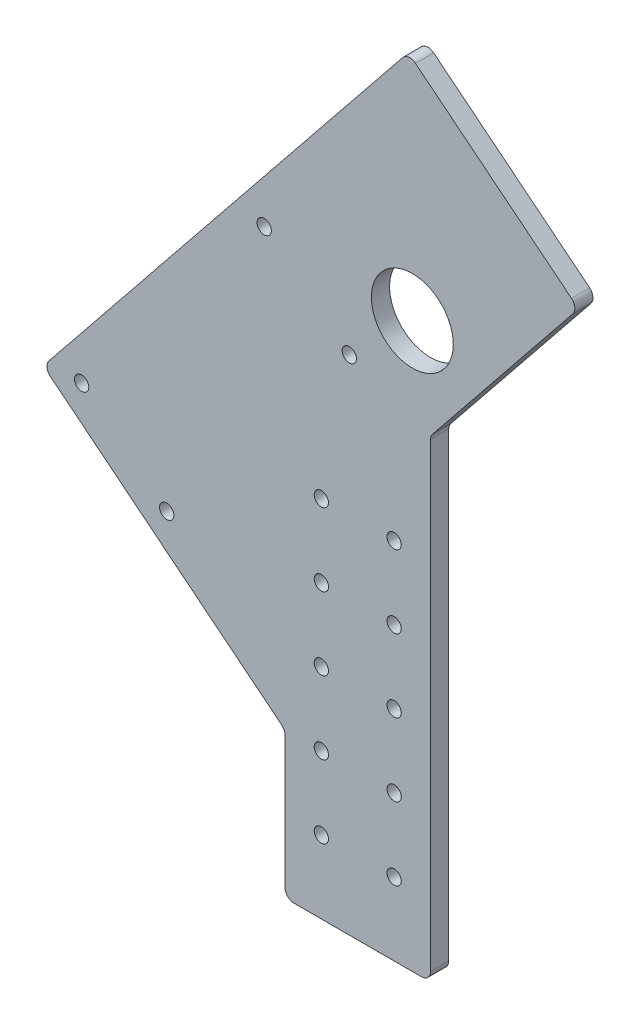
ISO-10303-21;
HEADER;
FILE_DESCRIPTION(('STEP AP214'),'2;1');
FILE_NAME('part.step','',(''),(''),'','','');
FILE_SCHEMA(('AUTOMOTIVE_DESIGN { 1 0 10303 214 1 1 1 1 }'));
ENDSEC;
DATA;
#1=APPLICATION_CONTEXT('core data for automotive mechanical design processes');
#2=APPLICATION_PROTOCOL_DEFINITION('international standard','automotive_design',2000,#1);
#3=PRODUCT_CONTEXT('',#1,'mechanical');
#4=PRODUCT('Part','Part','',(#3));
#5=PRODUCT_RELATED_PRODUCT_CATEGORY('part','',(#4));
#6=PRODUCT_DEFINITION_FORMATION('','',#4);
#7=PRODUCT_DEFINITION_CONTEXT('part definition',#1,'design');
#8=PRODUCT_DEFINITION('design','',#6,#7);
#9=PRODUCT_DEFINITION_SHAPE('','',#8);
#10=(LENGTH_UNIT() NAMED_UNIT(*) SI_UNIT(.MILLI.,.METRE.));
#11=(NAMED_UNIT(*) PLANE_ANGLE_UNIT() SI_UNIT($,.RADIAN.));
#12=(NAMED_UNIT(*) SI_UNIT($,.STERADIAN.) SOLID_ANGLE_UNIT());
#13=UNCERTAINTY_MEASURE_WITH_UNIT(LENGTH_MEASURE(1.E-05),#10,'distance_accuracy_value','');
#14=(GEOMETRIC_REPRESENTATION_CONTEXT(3) GLOBAL_UNCERTAINTY_ASSIGNED_CONTEXT((#13)) GLOBAL_UNIT_ASSIGNED_CONTEXT((#10,
#11,#12)) REPRESENTATION_CONTEXT('',''));
#15=CARTESIAN_POINT('',(0.,0.,0.));
#16=DIRECTION('',(0.,0.,1.));
#17=DIRECTION('',(1.,0.,0.));
#18=AXIS2_PLACEMENT_3D('',#15,#16,#17);
#19=CARTESIAN_POINT('',(555.620950118593,690.465880705157,6.35));
#20=DIRECTION('',(0.626927314469008,0.779077751172935,0.));
#21=DIRECTION('',(-0.779077751172935,0.626927314469008,0.));
#22=AXIS2_PLACEMENT_3D('',#19,#20,#21);
#23=PLANE('',#22);
#24=DIRECTION('',(0.779077751172935,-0.626927314469008,0.));
#25=VECTOR('',#24,1.);
#26=CARTESIAN_POINT('',(555.620950118593,690.465880705157,6.35));
#27=LINE('',#26,#25);
#28=CARTESIAN_POINT('',(591.644329675427,661.477707740825,6.35));
#29=VERTEX_POINT('',#28);
#30=CARTESIAN_POINT('',(646.062910594856,617.686834825165,6.35));
#31=VERTEX_POINT('',#30);
#32=EDGE_CURVE('E396',#29,#31,#27,.T.);
#33=ORIENTED_EDGE('',*,*,#32,.T.);
#34=DIRECTION('',(0.,0.,-1.));
#35=VECTOR('',#34,1.);
#36=CARTESIAN_POINT('',(646.062910594856,617.686834825165,0.));
#37=LINE('',#36,#35);
#38=CARTESIAN_POINT('',(646.062910594856,617.686834825165,0.));
#39=VERTEX_POINT('',#38);
#40=EDGE_CURVE('E159',#31,#39,#37,.T.);
#41=ORIENTED_EDGE('',*,*,#40,.T.);
#42=DIRECTION('',(0.779077751172935,-0.626927314469008,0.));
#43=VECTOR('',#42,1.);
#44=CARTESIAN_POINT('',(555.620950118593,690.465880705157,0.));
#45=LINE('',#44,#43);
#46=CARTESIAN_POINT('',(591.644329675427,661.477707740825,0.));
#47=VERTEX_POINT('',#46);
#48=EDGE_CURVE('E314',#47,#39,#45,.T.);
#49=ORIENTED_EDGE('',*,*,#48,.F.);
#50=DIRECTION('',(0.,0.,-1.));
#51=VECTOR('',#50,1.);
#52=CARTESIAN_POINT('',(591.644329675427,661.477707740825,6.35));
#53=LINE('',#52,#51);
#54=EDGE_CURVE('E252',#47,#29,#53,.F.);
#55=ORIENTED_EDGE('',*,*,#54,.T.);
#56=EDGE_LOOP('',(#33,#41,#49,#55));
#57=FACE_BOUND('',#56,.T.);
#58=ADVANCED_FACE('F45',(#57),#23,.T.);
#59=CARTESIAN_POINT('',(33.5498076968577,-26.9976787408911,6.35));
#60=DIRECTION('',(0.779077751172932,-0.626927314469011,0.));
#61=DIRECTION('',(0.626927314469011,0.779077751172933,0.));
#62=AXIS2_PLACEMENT_3D('',#59,#60,#61);
#63=PLANE('',#62);
#64=DIRECTION('',(-0.626927314469011,-0.779077751172932,0.));
#65=VECTOR('',#64,1.);
#66=CARTESIAN_POINT('',(33.5498076968577,-26.9976787408911,0.));
#67=LINE('',#66,#65);
#68=CARTESIAN_POINT('',(587.180263592014,660.994630104289,0.));
#69=VERTEX_POINT('',#68);
#70=CARTESIAN_POINT('',(463.769621738789,507.633174785898,0.));
#71=VERTEX_POINT('',#70);
#72=EDGE_CURVE('E273',#69,#71,#67,.T.);
#73=ORIENTED_EDGE('',*,*,#72,.T.);
#74=DIRECTION('',(0.,0.,-1.));
#75=VECTOR('',#74,1.);
#76=CARTESIAN_POINT('',(463.769621738789,507.633174785898,6.35));
#77=LINE('',#76,#75);
#78=CARTESIAN_POINT('',(463.769621738789,507.633174785898,6.35));
#79=VERTEX_POINT('',#78);
#80=EDGE_CURVE('E249',#71,#79,#77,.F.);
#81=ORIENTED_EDGE('',*,*,#80,.T.);
#82=DIRECTION('',(-0.626927314469011,-0.779077751172932,0.));
#83=VECTOR('',#82,1.);
#84=CARTESIAN_POINT('',(33.5498076968577,-26.9976787408911,6.35));
#85=LINE('',#84,#83);
#86=CARTESIAN_POINT('',(587.180263592014,660.994630104289,6.35));
#87=VERTEX_POINT('',#86);
#88=EDGE_CURVE('E288',#87,#79,#85,.T.);
#89=ORIENTED_EDGE('',*,*,#88,.F.);
#90=DIRECTION('',(0.,0.,-1.));
#91=VECTOR('',#90,1.);
#92=CARTESIAN_POINT('',(587.180263592014,660.994630104289,0.));
#93=LINE('',#92,#91);
#94=EDGE_CURVE('E245',#87,#69,#93,.T.);
#95=ORIENTED_EDGE('',*,*,#94,.T.);
#96=EDGE_LOOP('',(#73,#81,#89,#95));
#97=FACE_BOUND('',#96,.T.);
#98=ADVANCED_FACE('F350',(#97),#63,.F.);
#99=CARTESIAN_POINT('',(428.229319818492,532.157281666816,6.35));
#100=DIRECTION('',(0.62692731446901,0.779077751172933,0.));
#101=DIRECTION('',(-0.779077751172934,0.62692731446901,0.));
#102=AXIS2_PLACEMENT_3D('',#99,#100,#101);
#103=PLANE('',#102);
#104=DIRECTION('',(0.779077751172933,-0.62692731446901,0.));
#105=VECTOR('',#104,1.);
#106=CARTESIAN_POINT('',(428.229319818492,532.157281666816,0.));
#107=LINE('',#106,#105);
#108=CARTESIAN_POINT('',(464.252699375324,503.169108702485,0.));
#109=VERTEX_POINT('',#108);
#110=CARTESIAN_POINT('',(544.915494223451,438.259400684811,0.));
#111=VERTEX_POINT('',#110);
#112=EDGE_CURVE('E263',#109,#111,#107,.T.);
#113=ORIENTED_EDGE('',*,*,#112,.T.);
#114=DIRECTION('',(0.,0.,-1.));
#115=VECTOR('',#114,1.);
#116=CARTESIAN_POINT('',(544.915494223451,438.259400684811,6.35));
#117=LINE('',#116,#115);
#118=CARTESIAN_POINT('',(544.915494223451,438.259400684811,6.35));
#119=VERTEX_POINT('',#118);
#120=EDGE_CURVE('E242',#111,#119,#117,.F.);
#121=ORIENTED_EDGE('',*,*,#120,.T.);
#122=DIRECTION('',(0.779077751172933,-0.62692731446901,0.));
#123=VECTOR('',#122,1.);
#124=CARTESIAN_POINT('',(428.229319818492,532.157281666816,6.35));
#125=LINE('',#124,#123);
#126=CARTESIAN_POINT('',(464.252699375324,503.169108702485,6.35));
#127=VERTEX_POINT('',#126);
#128=EDGE_CURVE('E281',#127,#119,#125,.T.);
#129=ORIENTED_EDGE('',*,*,#128,.F.);
#130=DIRECTION('',(0.,0.,-1.));
#131=VECTOR('',#130,1.);
#132=CARTESIAN_POINT('',(464.252699375324,503.169108702485,6.35));
#133=LINE('',#132,#131);
#134=EDGE_CURVE('E238',#127,#109,#133,.T.);
#135=ORIENTED_EDGE('',*,*,#134,.T.);
#136=EDGE_LOOP('',(#113,#121,#129,#135));
#137=FACE_BOUND('',#136,.T.);
#138=ADVANCED_FACE('F269',(#137),#103,.F.);
#139=CARTESIAN_POINT('',(546.100000000012,0.,6.35));
#140=DIRECTION('',(-1.,0.,0.));
#141=DIRECTION('',(0.,0.,1.));
#142=AXIS2_PLACEMENT_3D('',#139,#140,#141);
#143=PLANE('',#142);
#144=DIRECTION('',(0.,1.,0.));
#145=VECTOR('',#144,1.);
#146=CARTESIAN_POINT('',(546.100000000012,0.,0.));
#147=LINE('',#146,#145);
#148=CARTESIAN_POINT('',(546.100000000012,389.681223643939,0.));
#149=VERTEX_POINT('',#148);
#150=CARTESIAN_POINT('',(546.100000000012,435.785828824837,0.));
#151=VERTEX_POINT('',#150);
#152=EDGE_CURVE('E264',#149,#151,#147,.T.);
#153=ORIENTED_EDGE('',*,*,#152,.F.);
#154=DIRECTION('',(0.,0.,-1.));
#155=VECTOR('',#154,1.);
#156=CARTESIAN_POINT('',(546.100000000012,389.681223643939,6.35));
#157=LINE('',#156,#155);
#158=CARTESIAN_POINT('',(546.100000000012,389.681223643939,6.35));
#159=VERTEX_POINT('',#158);
#160=EDGE_CURVE('E66',#149,#159,#157,.F.);
#161=ORIENTED_EDGE('',*,*,#160,.T.);
#162=DIRECTION('',(0.,1.,0.));
#163=VECTOR('',#162,1.);
#164=CARTESIAN_POINT('',(546.100000000012,0.,6.35));
#165=LINE('',#164,#163);
#166=CARTESIAN_POINT('',(546.100000000012,435.785828824837,6.35));
#167=VERTEX_POINT('',#166);
#168=EDGE_CURVE('E277',#159,#167,#165,.T.);
#169=ORIENTED_EDGE('',*,*,#168,.T.);
#170=DIRECTION('',(0.,0.,-1.));
#171=VECTOR('',#170,1.);
#172=CARTESIAN_POINT('',(546.100000000012,435.785828824837,6.35));
#173=LINE('',#172,#171);
#174=EDGE_CURVE('E232',#167,#151,#173,.T.);
#175=ORIENTED_EDGE('',*,*,#174,.T.);
#176=EDGE_LOOP('',(#153,#161,#169,#175));
#177=FACE_BOUND('',#176,.T.);
#178=ADVANCED_FACE('F276',(#177),#143,.T.);
#179=CARTESIAN_POINT('',(0.,386.506223643939,6.35));
#180=DIRECTION('',(0.,-1.,0.));
#181=DIRECTION('',(0.,0.,-1.));
#182=AXIS2_PLACEMENT_3D('',#179,#180,#181);
#183=PLANE('',#182);
#184=DIRECTION('',(-1.,0.,0.));
#185=VECTOR('',#184,1.);
#186=CARTESIAN_POINT('',(0.,386.506223643939,0.));
#187=LINE('',#186,#185);
#188=CARTESIAN_POINT('',(593.725000000012,386.506223643939,0.));
#189=VERTEX_POINT('',#188);
#190=CARTESIAN_POINT('',(549.275000000012,386.506223643939,0.));
#191=VERTEX_POINT('',#190);
#192=EDGE_CURVE('E185',#189,#191,#187,.T.);
#193=ORIENTED_EDGE('',*,*,#192,.F.);
#194=DIRECTION('',(0.,0.,-1.));
#195=VECTOR('',#194,1.);
#196=CARTESIAN_POINT('',(593.725000000012,386.506223643939,6.35));
#197=LINE('',#196,#195);
#198=CARTESIAN_POINT('',(593.725000000012,386.506223643939,6.35));
#199=VERTEX_POINT('',#198);
#200=EDGE_CURVE('E214',#189,#199,#197,.F.);
#201=ORIENTED_EDGE('',*,*,#200,.T.);
#202=DIRECTION('',(-1.,0.,0.));
#203=VECTOR('',#202,1.);
#204=CARTESIAN_POINT('',(0.,386.506223643939,6.35));
#205=LINE('',#204,#203);
#206=CARTESIAN_POINT('',(549.275000000012,386.506223643939,6.35));
#207=VERTEX_POINT('',#206);
#208=EDGE_CURVE('E280',#199,#207,#205,.T.);
#209=ORIENTED_EDGE('',*,*,#208,.T.);
#210=DIRECTION('',(0.,0.,-1.));
#211=VECTOR('',#210,1.);
#212=CARTESIAN_POINT('',(549.275000000012,386.506223643939,6.35));
#213=LINE('',#212,#211);
#214=EDGE_CURVE('E210',#207,#191,#213,.T.);
#215=ORIENTED_EDGE('',*,*,#214,.T.);
#216=EDGE_LOOP('',(#193,#201,#209,#215));
#217=FACE_BOUND('',#216,.T.);
#218=ADVANCED_FACE('F326',(#217),#183,.T.);
#219=CARTESIAN_POINT('',(596.900000000012,0.,6.35));
#220=DIRECTION('',(-1.,0.,0.));
#221=DIRECTION('',(0.,0.,1.));
#222=AXIS2_PLACEMENT_3D('',#219,#220,#221);
#223=PLANE('',#222);
#224=DIRECTION('',(0.,1.,0.));
#225=VECTOR('',#224,1.);
#226=CARTESIAN_POINT('',(596.900000000012,0.,0.));
#227=LINE('',#226,#225);
#228=CARTESIAN_POINT('',(596.900000000012,389.681223643939,0.));
#229=VERTEX_POINT('',#228);
#230=CARTESIAN_POINT('',(596.900000000012,550.409246189396,0.));
#231=VERTEX_POINT('',#230);
#232=EDGE_CURVE('E178',#229,#231,#227,.T.);
#233=ORIENTED_EDGE('',*,*,#232,.T.);
#234=DIRECTION('',(0.,0.,-1.));
#235=VECTOR('',#234,1.);
#236=CARTESIAN_POINT('',(596.900000000012,550.409246189396,6.35));
#237=LINE('',#236,#235);
#238=CARTESIAN_POINT('',(596.900000000012,550.409246189396,6.35));
#239=VERTEX_POINT('',#238);
#240=EDGE_CURVE('E152',#231,#239,#237,.F.);
#241=ORIENTED_EDGE('',*,*,#240,.T.);
#242=DIRECTION('',(0.,1.,0.));
#243=VECTOR('',#242,1.);
#244=CARTESIAN_POINT('',(596.900000000012,0.,6.35));
#245=LINE('',#244,#243);
#246=CARTESIAN_POINT('',(596.900000000012,389.681223643939,6.35));
#247=VERTEX_POINT('',#246);
#248=EDGE_CURVE('E286',#247,#239,#245,.T.);
#249=ORIENTED_EDGE('',*,*,#248,.F.);
#250=DIRECTION('',(0.,0.,-1.));
#251=VECTOR('',#250,1.);
#252=CARTESIAN_POINT('',(596.900000000012,389.681223643939,0.));
#253=LINE('',#252,#251);
#254=EDGE_CURVE('E170',#247,#229,#253,.T.);
#255=ORIENTED_EDGE('',*,*,#254,.T.);
#256=EDGE_LOOP('',(#233,#241,#249,#255));
#257=FACE_BOUND('',#256,.T.);
#258=ADVANCED_FACE('F336',(#257),#223,.F.);
#259=CARTESIAN_POINT('',(538.867140915641,585.763135354699,6.35));
#260=DIRECTION('',(0.,0.,-1.));
#261=DIRECTION('',(-1.,0.,0.));
#262=AXIS2_PLACEMENT_3D('',#259,#260,#261);
#263=CYLINDRICAL_SURFACE('',#262,2.48919999999983);
#264=CARTESIAN_POINT('',(538.867140915641,585.763135354699,6.35));
#265=DIRECTION('',(0.,0.,1.));
#266=DIRECTION('',(1.,0.,0.));
#267=AXIS2_PLACEMENT_3D('',#264,#265,#266);
#268=CIRCLE('',#267,2.48919999999983);
#269=CARTESIAN_POINT('',(541.356340915641,585.763135354699,6.35));
#270=VERTEX_POINT('',#269);
#271=EDGE_CURVE('E401',#270,#270,#268,.T.);
#272=ORIENTED_EDGE('',*,*,#271,.T.);
#273=EDGE_LOOP('',(#272));
#274=FACE_BOUND('',#273,.T.);
#275=CARTESIAN_POINT('',(538.867140915641,585.763135354699,0.));
#276=DIRECTION('',(0.,0.,1.));
#277=DIRECTION('',(1.,0.,0.));
#278=AXIS2_PLACEMENT_3D('',#275,#276,#277);
#279=CIRCLE('',#278,2.48919999999983);
#280=CARTESIAN_POINT('',(541.356340915641,585.763135354699,0.));
#281=VERTEX_POINT('',#280);
#282=EDGE_CURVE('E310',#281,#281,#279,.T.);
#283=ORIENTED_EDGE('',*,*,#282,.F.);
#284=EDGE_LOOP('',(#283));
#285=FACE_BOUND('',#284,.T.);
#286=ADVANCED_FACE('F338',(#274,#285),#263,.F.);
#287=CARTESIAN_POINT('',(568.55000323533,561.87720467343,6.35));
#288=DIRECTION('',(0.,0.,-1.));
#289=DIRECTION('',(-1.,0.,0.));
#290=AXIS2_PLACEMENT_3D('',#287,#288,#289);
#291=CYLINDRICAL_SURFACE('',#290,2.48919999999994);
#292=CARTESIAN_POINT('',(568.55000323533,561.87720467343,6.35));
#293=DIRECTION('',(0.,0.,1.));
#294=DIRECTION('',(1.,0.,0.));
#295=AXIS2_PLACEMENT_3D('',#292,#293,#294);
#296=CIRCLE('',#295,2.48919999999994);
#297=CARTESIAN_POINT('',(571.03920323533,561.87720467343,6.35));
#298=VERTEX_POINT('',#297);
#299=EDGE_CURVE('E407',#298,#298,#296,.T.);
#300=ORIENTED_EDGE('',*,*,#299,.T.);
#301=EDGE_LOOP('',(#300));
#302=FACE_BOUND('',#301,.T.);
#303=CARTESIAN_POINT('',(568.55000323533,561.87720467343,0.));
#304=DIRECTION('',(0.,0.,1.));
#305=DIRECTION('',(1.,0.,0.));
#306=AXIS2_PLACEMENT_3D('',#303,#304,#305);
#307=CIRCLE('',#306,2.48919999999994);
#308=CARTESIAN_POINT('',(571.03920323533,561.87720467343,0.));
#309=VERTEX_POINT('',#308);
#310=EDGE_CURVE('E306',#309,#309,#307,.T.);
#311=ORIENTED_EDGE('',*,*,#310,.F.);
#312=EDGE_LOOP('',(#311));
#313=FACE_BOUND('',#312,.T.);
#314=ADVANCED_FACE('F344',(#302,#313),#291,.F.);
#315=CARTESIAN_POINT('',(504.854188085278,482.72290515426,6.35));
#316=DIRECTION('',(0.,0.,-1.));
#317=DIRECTION('',(-1.,0.,0.));
#318=AXIS2_PLACEMENT_3D('',#315,#316,#317);
#319=CYLINDRICAL_SURFACE('',#318,2.48919999999995);
#320=CARTESIAN_POINT('',(504.854188085278,482.72290515426,6.35));
#321=DIRECTION('',(0.,0.,1.));
#322=DIRECTION('',(1.,0.,0.));
#323=AXIS2_PLACEMENT_3D('',#320,#321,#322);
#324=CIRCLE('',#323,2.48919999999995);
#325=CARTESIAN_POINT('',(507.343388085278,482.72290515426,6.35));
#326=VERTEX_POINT('',#325);
#327=EDGE_CURVE('E183',#326,#326,#324,.T.);
#328=ORIENTED_EDGE('',*,*,#327,.T.);
#329=EDGE_LOOP('',(#328));
#330=FACE_BOUND('',#329,.T.);
#331=CARTESIAN_POINT('',(504.854188085278,482.72290515426,0.));
#332=DIRECTION('',(0.,0.,1.));
#333=DIRECTION('',(1.,0.,0.));
#334=AXIS2_PLACEMENT_3D('',#331,#332,#333);
#335=CIRCLE('',#334,2.48919999999995);
#336=CARTESIAN_POINT('',(507.343388085278,482.72290515426,0.));
#337=VERTEX_POINT('',#336);
#338=EDGE_CURVE('E301',#337,#337,#335,.T.);
#339=ORIENTED_EDGE('',*,*,#338,.F.);
#340=EDGE_LOOP('',(#339));
#341=FACE_BOUND('',#340,.T.);
#342=ADVANCED_FACE('F363',(#330,#341),#319,.F.);
#343=CARTESIAN_POINT('',(475.17132576559,506.608835835529,6.35));
#344=DIRECTION('',(0.,0.,-1.));
#345=DIRECTION('',(-1.,0.,0.));
#346=AXIS2_PLACEMENT_3D('',#343,#344,#345);
#347=CYLINDRICAL_SURFACE('',#346,2.48919999999983);
#348=CARTESIAN_POINT('',(475.17132576559,506.608835835529,6.35));
#349=DIRECTION('',(0.,0.,1.));
#350=DIRECTION('',(1.,0.,0.));
#351=AXIS2_PLACEMENT_3D('',#348,#349,#350);
#352=CIRCLE('',#351,2.48919999999983);
#353=CARTESIAN_POINT('',(477.66052576559,506.608835835529,6.35));
#354=VERTEX_POINT('',#353);
#355=EDGE_CURVE('E177',#354,#354,#352,.T.);
#356=ORIENTED_EDGE('',*,*,#355,.T.);
#357=EDGE_LOOP('',(#356));
#358=FACE_BOUND('',#357,.T.);
#359=CARTESIAN_POINT('',(475.17132576559,506.608835835529,0.));
#360=DIRECTION('',(0.,0.,1.));
#361=DIRECTION('',(1.,0.,0.));
#362=AXIS2_PLACEMENT_3D('',#359,#360,#361);
#363=CIRCLE('',#362,2.48919999999983);
#364=CARTESIAN_POINT('',(477.66052576559,506.608835835529,0.));
#365=VERTEX_POINT('',#364);
#366=EDGE_CURVE('E297',#365,#365,#363,.T.);
#367=ORIENTED_EDGE('',*,*,#366,.F.);
#368=EDGE_LOOP('',(#367));
#369=FACE_BOUND('',#368,.T.);
#370=ADVANCED_FACE('F367',(#358,#369),#347,.F.);
#371=CARTESIAN_POINT('',(92.9155323362361,-74.7695401034303,6.35));
#372=DIRECTION('',(-0.779077751172933,0.62692731446901,0.));
#373=DIRECTION('',(-0.62692731446901,-0.779077751172933,0.));
#374=AXIS2_PLACEMENT_3D('',#371,#372,#373);
#375=PLANE('',#374);
#376=DIRECTION('',(0.62692731446901,0.779077751172933,0.));
#377=VECTOR('',#376,1.);
#378=CARTESIAN_POINT('',(92.9155323362361,-74.7695401034303,6.35));
#379=LINE('',#378,#377);
#380=CARTESIAN_POINT('',(597.601428140038,552.399740412835,6.35));
#381=VERTEX_POINT('',#380);
#382=CARTESIAN_POINT('',(646.545988231391,613.222768741752,6.35));
#383=VERTEX_POINT('',#382);
#384=EDGE_CURVE('E168',#381,#383,#379,.T.);
#385=ORIENTED_EDGE('',*,*,#384,.F.);
#386=DIRECTION('',(0.,0.,-1.));
#387=VECTOR('',#386,1.);
#388=CARTESIAN_POINT('',(597.601428140038,552.399740412835,0.));
#389=LINE('',#388,#387);
#390=CARTESIAN_POINT('',(597.601428140038,552.399740412835,0.));
#391=VERTEX_POINT('',#390);
#392=EDGE_CURVE('E151',#381,#391,#389,.T.);
#393=ORIENTED_EDGE('',*,*,#392,.T.);
#394=DIRECTION('',(0.62692731446901,0.779077751172933,0.));
#395=VECTOR('',#394,1.);
#396=CARTESIAN_POINT('',(92.9155323362361,-74.7695401034303,0.));
#397=LINE('',#396,#395);
#398=CARTESIAN_POINT('',(646.545988231391,613.222768741752,0.));
#399=VERTEX_POINT('',#398);
#400=EDGE_CURVE('E165',#391,#399,#397,.T.);
#401=ORIENTED_EDGE('',*,*,#400,.T.);
#402=DIRECTION('',(0.,0.,-1.));
#403=VECTOR('',#402,1.);
#404=CARTESIAN_POINT('',(646.545988231391,613.222768741751,6.35));
#405=LINE('',#404,#403);
#406=EDGE_CURVE('E171',#399,#383,#405,.F.);
#407=ORIENTED_EDGE('',*,*,#406,.T.);
#408=EDGE_LOOP('',(#385,#393,#401,#407));
#409=FACE_BOUND('',#408,.T.);
#410=ADVANCED_FACE('F164',(#409),#375,.F.);
#411=CARTESIAN_POINT('',(0.,0.,6.35));
#412=DIRECTION('',(0.,0.,1.));
#413=DIRECTION('',(1.,0.,0.));
#414=AXIS2_PLACEMENT_3D('',#411,#412,#413);
#415=PLANE('',#414);
#416=CARTESIAN_POINT('',(590.550000000012,583.139171886536,6.35));
#417=DIRECTION('',(0.,0.,1.));
#418=DIRECTION('',(1.,0.,0.));
#419=AXIS2_PLACEMENT_3D('',#416,#417,#418);
#420=CIRCLE('',#419,14.2875);
#421=CARTESIAN_POINT('',(604.837500000012,583.139171886536,6.35));
#422=VERTEX_POINT('',#421);
#423=EDGE_CURVE('E496',#422,#422,#420,.T.);
#424=ORIENTED_EDGE('',*,*,#423,.F.);
#425=EDGE_LOOP('',(#424));
#426=FACE_BOUND('',#425,.T.);
#427=CARTESIAN_POINT('',(584.200000000012,513.506223643939,6.35));
#428=DIRECTION('',(0.,0.,1.));
#429=DIRECTION('',(1.,0.,0.));
#430=AXIS2_PLACEMENT_3D('',#427,#428,#429);
#431=CIRCLE('',#430,2.48919999999994);
#432=CARTESIAN_POINT('',(586.689200000012,513.506223643939,6.35));
#433=VERTEX_POINT('',#432);
#434=EDGE_CURVE('E429',#433,#433,#431,.T.);
#435=ORIENTED_EDGE('',*,*,#434,.F.);
#436=EDGE_LOOP('',(#435));
#437=FACE_BOUND('',#436,.T.);
#438=CARTESIAN_POINT('',(558.800000000012,437.306223643939,6.35));
#439=DIRECTION('',(0.,0.,1.));
#440=DIRECTION('',(1.,0.,0.));
#441=AXIS2_PLACEMENT_3D('',#438,#439,#440);
#442=CIRCLE('',#441,2.48919999999995);
#443=CARTESIAN_POINT('',(561.289200000012,437.306223643939,6.35));
#444=VERTEX_POINT('',#443);
#445=EDGE_CURVE('E460',#444,#444,#442,.T.);
#446=ORIENTED_EDGE('',*,*,#445,.F.);
#447=EDGE_LOOP('',(#446));
#448=FACE_BOUND('',#447,.T.);
#449=CARTESIAN_POINT('',(558.800000000012,462.706223643939,6.35));
#450=DIRECTION('',(0.,0.,1.));
#451=DIRECTION('',(1.,0.,0.));
#452=AXIS2_PLACEMENT_3D('',#449,#450,#451);
#453=CIRCLE('',#452,2.48919999999995);
#454=CARTESIAN_POINT('',(561.289200000012,462.706223643939,6.35));
#455=VERTEX_POINT('',#454);
#456=EDGE_CURVE('E461',#455,#455,#453,.T.);
#457=ORIENTED_EDGE('',*,*,#456,.F.);
#458=EDGE_LOOP('',(#457));
#459=FACE_BOUND('',#458,.T.);
#460=CARTESIAN_POINT('',(558.800000000012,488.106223643939,6.35));
#461=DIRECTION('',(0.,0.,1.));
#462=DIRECTION('',(1.,0.,0.));
#463=AXIS2_PLACEMENT_3D('',#460,#461,#462);
#464=CIRCLE('',#463,2.48919999999995);
#465=CARTESIAN_POINT('',(561.289200000012,488.106223643939,6.35));
#466=VERTEX_POINT('',#465);
#467=EDGE_CURVE('E476',#466,#466,#464,.T.);
#468=ORIENTED_EDGE('',*,*,#467,.F.);
#469=EDGE_LOOP('',(#468));
#470=FACE_BOUND('',#469,.T.);
#471=CARTESIAN_POINT('',(584.200000000012,488.106223643939,6.35));
#472=DIRECTION('',(0.,0.,1.));
#473=DIRECTION('',(1.,0.,0.));
#474=AXIS2_PLACEMENT_3D('',#471,#472,#473);
#475=CIRCLE('',#474,2.48919999999995);
#476=CARTESIAN_POINT('',(586.689200000012,488.106223643939,6.35));
#477=VERTEX_POINT('',#476);
#478=EDGE_CURVE('E428',#477,#477,#475,.T.);
#479=ORIENTED_EDGE('',*,*,#478,.F.);
#480=EDGE_LOOP('',(#479));
#481=FACE_BOUND('',#480,.T.);
#482=CARTESIAN_POINT('',(584.200000000012,462.706223643939,6.35));
#483=DIRECTION('',(0.,0.,1.));
#484=DIRECTION('',(1.,0.,0.));
#485=AXIS2_PLACEMENT_3D('',#482,#483,#484);
#486=CIRCLE('',#485,2.48919999999995);
#487=CARTESIAN_POINT('',(586.689200000012,462.706223643939,6.35));
#488=VERTEX_POINT('',#487);
#489=EDGE_CURVE('E437',#488,#488,#486,.T.);
#490=ORIENTED_EDGE('',*,*,#489,.F.);
#491=EDGE_LOOP('',(#490));
#492=FACE_BOUND('',#491,.T.);
#493=CARTESIAN_POINT('',(584.200000000012,437.306223643939,6.35));
#494=DIRECTION('',(0.,0.,1.));
#495=DIRECTION('',(1.,0.,0.));
#496=AXIS2_PLACEMENT_3D('',#493,#494,#495);
#497=CIRCLE('',#496,2.48919999999995);
#498=CARTESIAN_POINT('',(586.689200000012,437.306223643939,6.35));
#499=VERTEX_POINT('',#498);
#500=EDGE_CURVE('E445',#499,#499,#497,.T.);
#501=ORIENTED_EDGE('',*,*,#500,.F.);
#502=EDGE_LOOP('',(#501));
#503=FACE_BOUND('',#502,.T.);
#504=CARTESIAN_POINT('',(584.200000000012,411.906223643939,6.35));
#505=DIRECTION('',(0.,0.,1.));
#506=DIRECTION('',(1.,0.,0.));
#507=AXIS2_PLACEMENT_3D('',#504,#505,#506);
#508=CIRCLE('',#507,2.48919999999995);
#509=CARTESIAN_POINT('',(586.689200000012,411.906223643939,6.35));
#510=VERTEX_POINT('',#509);
#511=EDGE_CURVE('E420',#510,#510,#508,.T.);
#512=ORIENTED_EDGE('',*,*,#511,.F.);
#513=EDGE_LOOP('',(#512));
#514=FACE_BOUND('',#513,.T.);
#515=CARTESIAN_POINT('',(558.800000000012,513.506223643939,6.35));
#516=DIRECTION('',(0.,0.,1.));
#517=DIRECTION('',(1.,0.,0.));
#518=AXIS2_PLACEMENT_3D('',#515,#516,#517);
#519=CIRCLE('',#518,2.48919999999994);
#520=CARTESIAN_POINT('',(561.289200000012,513.506223643939,6.35));
#521=VERTEX_POINT('',#520);
#522=EDGE_CURVE('E477',#521,#521,#519,.T.);
#523=ORIENTED_EDGE('',*,*,#522,.F.);
#524=EDGE_LOOP('',(#523));
#525=FACE_BOUND('',#524,.T.);
#526=CARTESIAN_POINT('',(558.800000000012,411.906223643939,6.35));
#527=DIRECTION('',(0.,0.,1.));
#528=DIRECTION('',(1.,0.,0.));
#529=AXIS2_PLACEMENT_3D('',#526,#527,#528);
#530=CIRCLE('',#529,2.48919999999995);
#531=CARTESIAN_POINT('',(561.289200000012,411.906223643939,6.35));
#532=VERTEX_POINT('',#531);
#533=EDGE_CURVE('E416',#532,#532,#530,.T.);
#534=ORIENTED_EDGE('',*,*,#533,.F.);
#535=EDGE_LOOP('',(#534));
#536=FACE_BOUND('',#535,.T.);
#537=ORIENTED_EDGE('',*,*,#355,.F.);
#538=EDGE_LOOP('',(#537));
#539=FACE_BOUND('',#538,.T.);
#540=ORIENTED_EDGE('',*,*,#327,.F.);
#541=EDGE_LOOP('',(#540));
#542=FACE_BOUND('',#541,.T.);
#543=ORIENTED_EDGE('',*,*,#299,.F.);
#544=EDGE_LOOP('',(#543));
#545=FACE_BOUND('',#544,.T.);
#546=ORIENTED_EDGE('',*,*,#271,.F.);
#547=EDGE_LOOP('',(#546));
#548=FACE_BOUND('',#547,.T.);
#549=ORIENTED_EDGE('',*,*,#208,.F.);
#550=CARTESIAN_POINT('',(593.725000000012,389.681223643939,6.35));
#551=DIRECTION('',(0.,0.,1.));
#552=DIRECTION('',(1.,0.,0.));
#553=AXIS2_PLACEMENT_3D('',#550,#551,#552);
#554=CIRCLE('',#553,3.175);
#555=EDGE_CURVE('E229',#199,#247,#554,.T.);
#556=ORIENTED_EDGE('',*,*,#555,.T.);
#557=ORIENTED_EDGE('',*,*,#248,.T.);
#558=CARTESIAN_POINT('',(600.075000000012,550.409246189396,6.35));
#559=DIRECTION('',(0.,0.,1.));
#560=DIRECTION('',(1.,0.,0.));
#561=AXIS2_PLACEMENT_3D('',#558,#559,#560);
#562=CIRCLE('',#561,3.175);
#563=EDGE_CURVE('E158',#239,#381,#562,.F.);
#564=ORIENTED_EDGE('',*,*,#563,.T.);
#565=ORIENTED_EDGE('',*,*,#384,.T.);
#566=CARTESIAN_POINT('',(644.072416371417,615.21326296519,6.35));
#567=DIRECTION('',(0.,0.,1.));
#568=DIRECTION('',(1.,0.,0.));
#569=AXIS2_PLACEMENT_3D('',#566,#567,#568);
#570=CIRCLE('',#569,3.175);
#571=EDGE_CURVE('E220',#383,#31,#570,.T.);
#572=ORIENTED_EDGE('',*,*,#571,.T.);
#573=ORIENTED_EDGE('',*,*,#32,.F.);
#574=CARTESIAN_POINT('',(589.653835451988,659.00413588085,6.35));
#575=DIRECTION('',(0.,0.,1.));
#576=DIRECTION('',(1.,0.,0.));
#577=AXIS2_PLACEMENT_3D('',#574,#575,#576);
#578=CIRCLE('',#577,3.175);
#579=EDGE_CURVE('E217',#29,#87,#578,.T.);
#580=ORIENTED_EDGE('',*,*,#579,.T.);
#581=ORIENTED_EDGE('',*,*,#88,.T.);
#582=CARTESIAN_POINT('',(466.243193598763,505.642680562459,6.35));
#583=DIRECTION('',(0.,0.,1.));
#584=DIRECTION('',(1.,0.,0.));
#585=AXIS2_PLACEMENT_3D('',#582,#583,#584);
#586=CIRCLE('',#585,3.175);
#587=EDGE_CURVE('E223',#79,#127,#586,.T.);
#588=ORIENTED_EDGE('',*,*,#587,.T.);
#589=ORIENTED_EDGE('',*,*,#128,.T.);
#590=CARTESIAN_POINT('',(542.925000000012,435.785828824837,6.35));
#591=DIRECTION('',(0.,0.,1.));
#592=DIRECTION('',(1.,0.,0.));
#593=AXIS2_PLACEMENT_3D('',#590,#591,#592);
#594=CIRCLE('',#593,3.175);
#595=EDGE_CURVE('E11',#119,#167,#594,.F.);
#596=ORIENTED_EDGE('',*,*,#595,.T.);
#597=ORIENTED_EDGE('',*,*,#168,.F.);
#598=CARTESIAN_POINT('',(549.275000000012,389.681223643939,6.35));
#599=DIRECTION('',(0.,0.,1.));
#600=DIRECTION('',(1.,0.,0.));
#601=AXIS2_PLACEMENT_3D('',#598,#599,#600);
#602=CIRCLE('',#601,3.175);
#603=EDGE_CURVE('E226',#159,#207,#602,.T.);
#604=ORIENTED_EDGE('',*,*,#603,.T.);
#605=EDGE_LOOP('',(#549,#556,#557,#564,#565,#572,#573,#580,#581,#588,#589,#596,#597,#604));
#606=FACE_BOUND('',#605,.T.);
#607=ADVANCED_FACE('F334',(#426,#437,#448,#459,#470,#481,#492,#503,#514,#525,#536,#539,#542,
#545,#548,#606),#415,.T.);
#608=CARTESIAN_POINT('',(0.,0.,0.));
#609=DIRECTION('',(0.,0.,1.));
#610=DIRECTION('',(1.,0.,0.));
#611=AXIS2_PLACEMENT_3D('',#608,#609,#610);
#612=PLANE('',#611);
#613=CARTESIAN_POINT('',(590.550000000012,583.139171886536,0.));
#614=DIRECTION('',(0.,0.,1.));
#615=DIRECTION('',(1.,0.,0.));
#616=AXIS2_PLACEMENT_3D('',#613,#614,#615);
#617=CIRCLE('',#616,14.2875);
#618=CARTESIAN_POINT('',(604.837500000012,583.139171886536,0.));
#619=VERTEX_POINT('',#618);
#620=EDGE_CURVE('E492',#619,#619,#617,.T.);
#621=ORIENTED_EDGE('',*,*,#620,.T.);
#622=EDGE_LOOP('',(#621));
#623=FACE_BOUND('',#622,.T.);
#624=CARTESIAN_POINT('',(584.200000000012,513.506223643939,0.));
#625=DIRECTION('',(0.,0.,1.));
#626=DIRECTION('',(1.,0.,0.));
#627=AXIS2_PLACEMENT_3D('',#624,#625,#626);
#628=CIRCLE('',#627,2.48919999999994);
#629=CARTESIAN_POINT('',(586.689200000012,513.506223643939,0.));
#630=VERTEX_POINT('',#629);
#631=EDGE_CURVE('E465',#630,#630,#628,.T.);
#632=ORIENTED_EDGE('',*,*,#631,.T.);
#633=EDGE_LOOP('',(#632));
#634=FACE_BOUND('',#633,.T.);
#635=CARTESIAN_POINT('',(558.800000000012,437.306223643939,0.));
#636=DIRECTION('',(0.,0.,1.));
#637=DIRECTION('',(1.,0.,0.));
#638=AXIS2_PLACEMENT_3D('',#635,#636,#637);
#639=CIRCLE('',#638,2.48919999999995);
#640=CARTESIAN_POINT('',(561.289200000012,437.306223643939,0.));
#641=VERTEX_POINT('',#640);
#642=EDGE_CURVE('E456',#641,#641,#639,.T.);
#643=ORIENTED_EDGE('',*,*,#642,.T.);
#644=EDGE_LOOP('',(#643));
#645=FACE_BOUND('',#644,.T.);
#646=CARTESIAN_POINT('',(558.800000000012,462.706223643939,0.));
#647=DIRECTION('',(0.,0.,1.));
#648=DIRECTION('',(1.,0.,0.));
#649=AXIS2_PLACEMENT_3D('',#646,#647,#648);
#650=CIRCLE('',#649,2.48919999999995);
#651=CARTESIAN_POINT('',(561.289200000012,462.706223643939,0.));
#652=VERTEX_POINT('',#651);
#653=EDGE_CURVE('E481',#652,#652,#650,.T.);
#654=ORIENTED_EDGE('',*,*,#653,.T.);
#655=EDGE_LOOP('',(#654));
#656=FACE_BOUND('',#655,.T.);
#657=CARTESIAN_POINT('',(558.800000000012,488.106223643939,0.));
#658=DIRECTION('',(0.,0.,1.));
#659=DIRECTION('',(1.,0.,0.));
#660=AXIS2_PLACEMENT_3D('',#657,#658,#659);
#661=CIRCLE('',#660,2.48919999999995);
#662=CARTESIAN_POINT('',(561.289200000012,488.106223643939,0.));
#663=VERTEX_POINT('',#662);
#664=EDGE_CURVE('E472',#663,#663,#661,.T.);
#665=ORIENTED_EDGE('',*,*,#664,.T.);
#666=EDGE_LOOP('',(#665));
#667=FACE_BOUND('',#666,.T.);
#668=CARTESIAN_POINT('',(584.200000000012,488.106223643939,0.));
#669=DIRECTION('',(0.,0.,1.));
#670=DIRECTION('',(1.,0.,0.));
#671=AXIS2_PLACEMENT_3D('',#668,#669,#670);
#672=CIRCLE('',#671,2.48919999999995);
#673=CARTESIAN_POINT('',(586.689200000012,488.106223643939,0.));
#674=VERTEX_POINT('',#673);
#675=EDGE_CURVE('E424',#674,#674,#672,.T.);
#676=ORIENTED_EDGE('',*,*,#675,.T.);
#677=EDGE_LOOP('',(#676));
#678=FACE_BOUND('',#677,.T.);
#679=CARTESIAN_POINT('',(584.200000000012,462.706223643939,0.));
#680=DIRECTION('',(0.,0.,1.));
#681=DIRECTION('',(1.,0.,0.));
#682=AXIS2_PLACEMENT_3D('',#679,#680,#681);
#683=CIRCLE('',#682,2.48919999999995);
#684=CARTESIAN_POINT('',(586.689200000012,462.706223643939,0.));
#685=VERTEX_POINT('',#684);
#686=EDGE_CURVE('E433',#685,#685,#683,.T.);
#687=ORIENTED_EDGE('',*,*,#686,.T.);
#688=EDGE_LOOP('',(#687));
#689=FACE_BOUND('',#688,.T.);
#690=CARTESIAN_POINT('',(584.200000000012,437.306223643939,0.));
#691=DIRECTION('',(0.,0.,1.));
#692=DIRECTION('',(1.,0.,0.));
#693=AXIS2_PLACEMENT_3D('',#690,#691,#692);
#694=CIRCLE('',#693,2.48919999999995);
#695=CARTESIAN_POINT('',(586.689200000012,437.306223643939,0.));
#696=VERTEX_POINT('',#695);
#697=EDGE_CURVE('E441',#696,#696,#694,.T.);
#698=ORIENTED_EDGE('',*,*,#697,.T.);
#699=EDGE_LOOP('',(#698));
#700=FACE_BOUND('',#699,.T.);
#701=CARTESIAN_POINT('',(584.200000000012,411.906223643939,0.));
#702=DIRECTION('',(0.,0.,1.));
#703=DIRECTION('',(1.,0.,0.));
#704=AXIS2_PLACEMENT_3D('',#701,#702,#703);
#705=CIRCLE('',#704,2.48919999999995);
#706=CARTESIAN_POINT('',(586.689200000012,411.906223643939,0.));
#707=VERTEX_POINT('',#706);
#708=EDGE_CURVE('E449',#707,#707,#705,.T.);
#709=ORIENTED_EDGE('',*,*,#708,.T.);
#710=EDGE_LOOP('',(#709));
#711=FACE_BOUND('',#710,.T.);
#712=CARTESIAN_POINT('',(558.800000000012,513.506223643939,0.));
#713=DIRECTION('',(0.,0.,1.));
#714=DIRECTION('',(1.,0.,0.));
#715=AXIS2_PLACEMENT_3D('',#712,#713,#714);
#716=CIRCLE('',#715,2.48919999999994);
#717=CARTESIAN_POINT('',(561.289200000012,513.506223643939,0.));
#718=VERTEX_POINT('',#717);
#719=EDGE_CURVE('E488',#718,#718,#716,.T.);
#720=ORIENTED_EDGE('',*,*,#719,.T.);
#721=EDGE_LOOP('',(#720));
#722=FACE_BOUND('',#721,.T.);
#723=CARTESIAN_POINT('',(558.800000000012,411.906223643939,0.));
#724=DIRECTION('',(0.,0.,1.));
#725=DIRECTION('',(1.,0.,0.));
#726=AXIS2_PLACEMENT_3D('',#723,#724,#725);
#727=CIRCLE('',#726,2.48919999999995);
#728=CARTESIAN_POINT('',(561.289200000012,411.906223643939,0.));
#729=VERTEX_POINT('',#728);
#730=EDGE_CURVE('E302',#729,#729,#727,.T.);
#731=ORIENTED_EDGE('',*,*,#730,.T.);
#732=EDGE_LOOP('',(#731));
#733=FACE_BOUND('',#732,.T.);
#734=ORIENTED_EDGE('',*,*,#366,.T.);
#735=EDGE_LOOP('',(#734));
#736=FACE_BOUND('',#735,.T.);
#737=ORIENTED_EDGE('',*,*,#338,.T.);
#738=EDGE_LOOP('',(#737));
#739=FACE_BOUND('',#738,.T.);
#740=ORIENTED_EDGE('',*,*,#310,.T.);
#741=EDGE_LOOP('',(#740));
#742=FACE_BOUND('',#741,.T.);
#743=ORIENTED_EDGE('',*,*,#282,.T.);
#744=EDGE_LOOP('',(#743));
#745=FACE_BOUND('',#744,.T.);
#746=ORIENTED_EDGE('',*,*,#232,.F.);
#747=CARTESIAN_POINT('',(593.725000000012,389.681223643939,0.));
#748=DIRECTION('',(0.,0.,1.));
#749=DIRECTION('',(1.,0.,0.));
#750=AXIS2_PLACEMENT_3D('',#747,#748,#749);
#751=CIRCLE('',#750,3.175);
#752=EDGE_CURVE('E207',#229,#189,#751,.F.);
#753=ORIENTED_EDGE('',*,*,#752,.T.);
#754=ORIENTED_EDGE('',*,*,#192,.T.);
#755=CARTESIAN_POINT('',(549.275000000012,389.681223643939,0.));
#756=DIRECTION('',(0.,0.,1.));
#757=DIRECTION('',(1.,0.,0.));
#758=AXIS2_PLACEMENT_3D('',#755,#756,#757);
#759=CIRCLE('',#758,3.175);
#760=EDGE_CURVE('E204',#191,#149,#759,.F.);
#761=ORIENTED_EDGE('',*,*,#760,.T.);
#762=ORIENTED_EDGE('',*,*,#152,.T.);
#763=CARTESIAN_POINT('',(542.925000000012,435.785828824837,0.));
#764=DIRECTION('',(0.,0.,1.));
#765=DIRECTION('',(1.,0.,0.));
#766=AXIS2_PLACEMENT_3D('',#763,#764,#765);
#767=CIRCLE('',#766,3.175);
#768=EDGE_CURVE('E54',#151,#111,#767,.T.);
#769=ORIENTED_EDGE('',*,*,#768,.T.);
#770=ORIENTED_EDGE('',*,*,#112,.F.);
#771=CARTESIAN_POINT('',(466.243193598763,505.642680562459,0.));
#772=DIRECTION('',(0.,0.,1.));
#773=DIRECTION('',(1.,0.,0.));
#774=AXIS2_PLACEMENT_3D('',#771,#772,#773);
#775=CIRCLE('',#774,3.175);
#776=EDGE_CURVE('E201',#109,#71,#775,.F.);
#777=ORIENTED_EDGE('',*,*,#776,.T.);
#778=ORIENTED_EDGE('',*,*,#72,.F.);
#779=CARTESIAN_POINT('',(589.653835451988,659.00413588085,0.));
#780=DIRECTION('',(0.,0.,1.));
#781=DIRECTION('',(1.,0.,0.));
#782=AXIS2_PLACEMENT_3D('',#779,#780,#781);
#783=CIRCLE('',#782,3.175);
#784=EDGE_CURVE('E196',#69,#47,#783,.F.);
#785=ORIENTED_EDGE('',*,*,#784,.T.);
#786=ORIENTED_EDGE('',*,*,#48,.T.);
#787=CARTESIAN_POINT('',(644.072416371417,615.21326296519,0.));
#788=DIRECTION('',(0.,0.,1.));
#789=DIRECTION('',(1.,0.,0.));
#790=AXIS2_PLACEMENT_3D('',#787,#788,#789);
#791=CIRCLE('',#790,3.175);
#792=EDGE_CURVE('E175',#39,#399,#791,.F.);
#793=ORIENTED_EDGE('',*,*,#792,.T.);
#794=ORIENTED_EDGE('',*,*,#400,.F.);
#795=CARTESIAN_POINT('',(600.075000000012,550.409246189396,0.));
#796=DIRECTION('',(0.,0.,1.));
#797=DIRECTION('',(1.,0.,0.));
#798=AXIS2_PLACEMENT_3D('',#795,#796,#797);
#799=CIRCLE('',#798,3.175);
#800=EDGE_CURVE('E147',#391,#231,#799,.T.);
#801=ORIENTED_EDGE('',*,*,#800,.T.);
#802=EDGE_LOOP('',(#746,#753,#754,#761,#762,#769,#770,#777,#778,#785,#786,#793,#794,#801));
#803=FACE_BOUND('',#802,.T.);
#804=ADVANCED_FACE('F173',(#623,#634,#645,#656,#667,#678,#689,#700,#711,#722,#733,#736,#739,
#742,#745,#803),#612,.F.);
#805=CARTESIAN_POINT('',(558.800000000012,411.906223643939,0.));
#806=DIRECTION('',(0.,0.,1.));
#807=DIRECTION('',(1.,0.,0.));
#808=AXIS2_PLACEMENT_3D('',#805,#806,#807);
#809=CYLINDRICAL_SURFACE('',#808,2.48919999999995);
#810=ORIENTED_EDGE('',*,*,#730,.F.);
#811=EDGE_LOOP('',(#810));
#812=FACE_BOUND('',#811,.T.);
#813=ORIENTED_EDGE('',*,*,#533,.T.);
#814=EDGE_LOOP('',(#813));
#815=FACE_BOUND('',#814,.T.);
#816=ADVANCED_FACE('F546',(#812,#815),#809,.F.);
#817=CARTESIAN_POINT('',(558.800000000012,513.506223643939,0.));
#818=DIRECTION('',(0.,0.,1.));
#819=DIRECTION('',(1.,0.,0.));
#820=AXIS2_PLACEMENT_3D('',#817,#818,#819);
#821=CYLINDRICAL_SURFACE('',#820,2.48919999999994);
#822=ORIENTED_EDGE('',*,*,#719,.F.);
#823=EDGE_LOOP('',(#822));
#824=FACE_BOUND('',#823,.T.);
#825=ORIENTED_EDGE('',*,*,#522,.T.);
#826=EDGE_LOOP('',(#825));
#827=FACE_BOUND('',#826,.T.);
#828=ADVANCED_FACE('F551',(#824,#827),#821,.F.);
#829=CARTESIAN_POINT('',(584.200000000012,411.906223643939,0.));
#830=DIRECTION('',(0.,0.,1.));
#831=DIRECTION('',(1.,0.,0.));
#832=AXIS2_PLACEMENT_3D('',#829,#830,#831);
#833=CYLINDRICAL_SURFACE('',#832,2.48919999999995);
#834=ORIENTED_EDGE('',*,*,#708,.F.);
#835=EDGE_LOOP('',(#834));
#836=FACE_BOUND('',#835,.T.);
#837=ORIENTED_EDGE('',*,*,#511,.T.);
#838=EDGE_LOOP('',(#837));
#839=FACE_BOUND('',#838,.T.);
#840=ADVANCED_FACE('F699',(#836,#839),#833,.F.);
#841=CARTESIAN_POINT('',(584.200000000012,437.306223643939,0.));
#842=DIRECTION('',(0.,0.,1.));
#843=DIRECTION('',(1.,0.,0.));
#844=AXIS2_PLACEMENT_3D('',#841,#842,#843);
#845=CYLINDRICAL_SURFACE('',#844,2.48919999999995);
#846=ORIENTED_EDGE('',*,*,#697,.F.);
#847=EDGE_LOOP('',(#846));
#848=FACE_BOUND('',#847,.T.);
#849=ORIENTED_EDGE('',*,*,#500,.T.);
#850=EDGE_LOOP('',(#849));
#851=FACE_BOUND('',#850,.T.);
#852=ADVANCED_FACE('F689',(#848,#851),#845,.F.);
#853=CARTESIAN_POINT('',(584.200000000012,462.706223643939,0.));
#854=DIRECTION('',(0.,0.,1.));
#855=DIRECTION('',(1.,0.,0.));
#856=AXIS2_PLACEMENT_3D('',#853,#854,#855);
#857=CYLINDRICAL_SURFACE('',#856,2.48919999999995);
#858=ORIENTED_EDGE('',*,*,#686,.F.);
#859=EDGE_LOOP('',(#858));
#860=FACE_BOUND('',#859,.T.);
#861=ORIENTED_EDGE('',*,*,#489,.T.);
#862=EDGE_LOOP('',(#861));
#863=FACE_BOUND('',#862,.T.);
#864=ADVANCED_FACE('F679',(#860,#863),#857,.F.);
#865=CARTESIAN_POINT('',(584.200000000012,488.106223643939,0.));
#866=DIRECTION('',(0.,0.,1.));
#867=DIRECTION('',(1.,0.,0.));
#868=AXIS2_PLACEMENT_3D('',#865,#866,#867);
#869=CYLINDRICAL_SURFACE('',#868,2.48919999999995);
#870=ORIENTED_EDGE('',*,*,#675,.F.);
#871=EDGE_LOOP('',(#870));
#872=FACE_BOUND('',#871,.T.);
#873=ORIENTED_EDGE('',*,*,#478,.T.);
#874=EDGE_LOOP('',(#873));
#875=FACE_BOUND('',#874,.T.);
#876=ADVANCED_FACE('F669',(#872,#875),#869,.F.);
#877=CARTESIAN_POINT('',(558.800000000012,488.106223643939,0.));
#878=DIRECTION('',(0.,0.,1.));
#879=DIRECTION('',(1.,0.,0.));
#880=AXIS2_PLACEMENT_3D('',#877,#878,#879);
#881=CYLINDRICAL_SURFACE('',#880,2.48919999999995);
#882=ORIENTED_EDGE('',*,*,#664,.F.);
#883=EDGE_LOOP('',(#882));
#884=FACE_BOUND('',#883,.T.);
#885=ORIENTED_EDGE('',*,*,#467,.T.);
#886=EDGE_LOOP('',(#885));
#887=FACE_BOUND('',#886,.T.);
#888=ADVANCED_FACE('F659',(#884,#887),#881,.F.);
#889=CARTESIAN_POINT('',(558.800000000012,462.706223643939,0.));
#890=DIRECTION('',(0.,0.,1.));
#891=DIRECTION('',(1.,0.,0.));
#892=AXIS2_PLACEMENT_3D('',#889,#890,#891);
#893=CYLINDRICAL_SURFACE('',#892,2.48919999999995);
#894=ORIENTED_EDGE('',*,*,#653,.F.);
#895=EDGE_LOOP('',(#894));
#896=FACE_BOUND('',#895,.T.);
#897=ORIENTED_EDGE('',*,*,#456,.T.);
#898=EDGE_LOOP('',(#897));
#899=FACE_BOUND('',#898,.T.);
#900=ADVANCED_FACE('F649',(#896,#899),#893,.F.);
#901=CARTESIAN_POINT('',(558.800000000012,437.306223643939,0.));
#902=DIRECTION('',(0.,0.,1.));
#903=DIRECTION('',(1.,0.,0.));
#904=AXIS2_PLACEMENT_3D('',#901,#902,#903);
#905=CYLINDRICAL_SURFACE('',#904,2.48919999999995);
#906=ORIENTED_EDGE('',*,*,#642,.F.);
#907=EDGE_LOOP('',(#906));
#908=FACE_BOUND('',#907,.T.);
#909=ORIENTED_EDGE('',*,*,#445,.T.);
#910=EDGE_LOOP('',(#909));
#911=FACE_BOUND('',#910,.T.);
#912=ADVANCED_FACE('F639',(#908,#911),#905,.F.);
#913=CARTESIAN_POINT('',(584.200000000012,513.506223643939,0.));
#914=DIRECTION('',(0.,0.,1.));
#915=DIRECTION('',(1.,0.,0.));
#916=AXIS2_PLACEMENT_3D('',#913,#914,#915);
#917=CYLINDRICAL_SURFACE('',#916,2.48919999999994);
#918=ORIENTED_EDGE('',*,*,#631,.F.);
#919=EDGE_LOOP('',(#918));
#920=FACE_BOUND('',#919,.T.);
#921=ORIENTED_EDGE('',*,*,#434,.T.);
#922=EDGE_LOOP('',(#921));
#923=FACE_BOUND('',#922,.T.);
#924=ADVANCED_FACE('F508',(#920,#923),#917,.F.);
#925=CARTESIAN_POINT('',(590.550000000012,583.139171886536,0.));
#926=DIRECTION('',(0.,0.,1.));
#927=DIRECTION('',(1.,0.,0.));
#928=AXIS2_PLACEMENT_3D('',#925,#926,#927);
#929=CYLINDRICAL_SURFACE('',#928,14.2875);
#930=ORIENTED_EDGE('',*,*,#620,.F.);
#931=EDGE_LOOP('',(#930));
#932=FACE_BOUND('',#931,.T.);
#933=ORIENTED_EDGE('',*,*,#423,.T.);
#934=EDGE_LOOP('',(#933));
#935=FACE_BOUND('',#934,.T.);
#936=ADVANCED_FACE('F374',(#932,#935),#929,.F.);
#937=CARTESIAN_POINT('',(600.075000000012,550.409246189396,6.35));
#938=DIRECTION('',(0.,0.,1.));
#939=DIRECTION('',(1.,0.,0.));
#940=AXIS2_PLACEMENT_3D('',#937,#938,#939);
#941=CYLINDRICAL_SURFACE('',#940,3.175);
#942=ORIENTED_EDGE('',*,*,#563,.F.);
#943=ORIENTED_EDGE('',*,*,#240,.F.);
#944=ORIENTED_EDGE('',*,*,#800,.F.);
#945=ORIENTED_EDGE('',*,*,#392,.F.);
#946=EDGE_LOOP('',(#942,#943,#944,#945));
#947=FACE_BOUND('',#946,.T.);
#948=ADVANCED_FACE('F150',(#947),#941,.F.);
#949=CARTESIAN_POINT('',(593.725000000012,389.681223643939,6.35));
#950=DIRECTION('',(0.,0.,1.));
#951=DIRECTION('',(1.,0.,0.));
#952=AXIS2_PLACEMENT_3D('',#949,#950,#951);
#953=CYLINDRICAL_SURFACE('',#952,3.175);
#954=ORIENTED_EDGE('',*,*,#555,.F.);
#955=ORIENTED_EDGE('',*,*,#200,.F.);
#956=ORIENTED_EDGE('',*,*,#752,.F.);
#957=ORIENTED_EDGE('',*,*,#254,.F.);
#958=EDGE_LOOP('',(#954,#955,#956,#957));
#959=FACE_BOUND('',#958,.T.);
#960=ADVANCED_FACE('F331',(#959),#953,.T.);
#961=CARTESIAN_POINT('',(549.275000000012,389.681223643939,6.35));
#962=DIRECTION('',(0.,0.,-1.));
#963=DIRECTION('',(-1.,0.,0.));
#964=AXIS2_PLACEMENT_3D('',#961,#962,#963);
#965=CYLINDRICAL_SURFACE('',#964,3.175);
#966=ORIENTED_EDGE('',*,*,#603,.F.);
#967=ORIENTED_EDGE('',*,*,#160,.F.);
#968=ORIENTED_EDGE('',*,*,#760,.F.);
#969=ORIENTED_EDGE('',*,*,#214,.F.);
#970=EDGE_LOOP('',(#966,#967,#968,#969));
#971=FACE_BOUND('',#970,.T.);
#972=ADVANCED_FACE('F377',(#971),#965,.T.);
#973=CARTESIAN_POINT('',(542.925000000012,435.785828824837,6.35));
#974=DIRECTION('',(0.,0.,-1.));
#975=DIRECTION('',(-1.,0.,0.));
#976=AXIS2_PLACEMENT_3D('',#973,#974,#975);
#977=CYLINDRICAL_SURFACE('',#976,3.175);
#978=ORIENTED_EDGE('',*,*,#595,.F.);
#979=ORIENTED_EDGE('',*,*,#120,.F.);
#980=ORIENTED_EDGE('',*,*,#768,.F.);
#981=ORIENTED_EDGE('',*,*,#174,.F.);
#982=EDGE_LOOP('',(#978,#979,#980,#981));
#983=FACE_BOUND('',#982,.T.);
#984=ADVANCED_FACE('F275',(#983),#977,.F.);
#985=CARTESIAN_POINT('',(466.243193598763,505.642680562459,6.35));
#986=DIRECTION('',(0.,0.,-1.));
#987=DIRECTION('',(-1.,0.,0.));
#988=AXIS2_PLACEMENT_3D('',#985,#986,#987);
#989=CYLINDRICAL_SURFACE('',#988,3.175);
#990=ORIENTED_EDGE('',*,*,#587,.F.);
#991=ORIENTED_EDGE('',*,*,#80,.F.);
#992=ORIENTED_EDGE('',*,*,#776,.F.);
#993=ORIENTED_EDGE('',*,*,#134,.F.);
#994=EDGE_LOOP('',(#990,#991,#992,#993));
#995=FACE_BOUND('',#994,.T.);
#996=ADVANCED_FACE('F383',(#995),#989,.T.);
#997=CARTESIAN_POINT('',(644.072416371417,615.21326296519,6.35));
#998=DIRECTION('',(0.,0.,1.));
#999=DIRECTION('',(1.,0.,0.));
#1000=AXIS2_PLACEMENT_3D('',#997,#998,#999);
#1001=CYLINDRICAL_SURFACE('',#1000,3.175);
#1002=ORIENTED_EDGE('',*,*,#571,.F.);
#1003=ORIENTED_EDGE('',*,*,#406,.F.);
#1004=ORIENTED_EDGE('',*,*,#792,.F.);
#1005=ORIENTED_EDGE('',*,*,#40,.F.);
#1006=EDGE_LOOP('',(#1002,#1003,#1004,#1005));
#1007=FACE_BOUND('',#1006,.T.);
#1008=ADVANCED_FACE('F385',(#1007),#1001,.T.);
#1009=CARTESIAN_POINT('',(589.653835451988,659.00413588085,6.35));
#1010=DIRECTION('',(0.,0.,1.));
#1011=DIRECTION('',(1.,0.,0.));
#1012=AXIS2_PLACEMENT_3D('',#1009,#1010,#1011);
#1013=CYLINDRICAL_SURFACE('',#1012,3.175);
#1014=ORIENTED_EDGE('',*,*,#579,.F.);
#1015=ORIENTED_EDGE('',*,*,#54,.F.);
#1016=ORIENTED_EDGE('',*,*,#784,.F.);
#1017=ORIENTED_EDGE('',*,*,#94,.F.);
#1018=EDGE_LOOP('',(#1014,#1015,#1016,#1017));
#1019=FACE_BOUND('',#1018,.T.);
#1020=ADVANCED_FACE('F47',(#1019),#1013,.T.);
#1021=CLOSED_SHELL('',(#58,#98,#138,#178,#218,#258,#286,#314,#342,#370,#410,#607,#804,#816,#828,
#840,#852,#864,#876,#888,#900,#912,#924,#936,#948,#960,#972,#984,#996,#1008,#1020));
#1022=MANIFOLD_SOLID_BREP('B2',#1021);
#1023=ADVANCED_BREP_SHAPE_REPRESENTATION('',(#18,#1022),#14);
#1024=SHAPE_DEFINITION_REPRESENTATION(#9,#1023);
ENDSEC;
END-ISO-10303-21;
